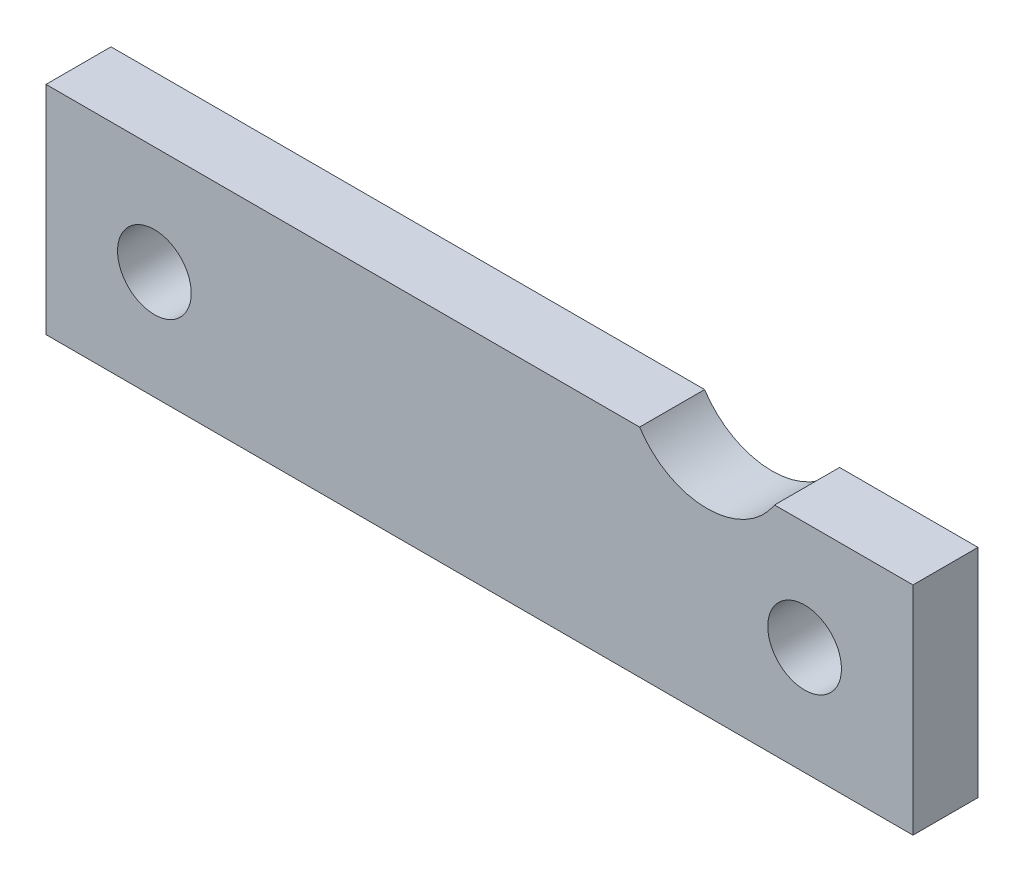
ISO-10303-21;
HEADER;
FILE_DESCRIPTION(('STEP AP214'),'2;1');
FILE_NAME('part.step','',(''),(''),'','','');
FILE_SCHEMA(('AUTOMOTIVE_DESIGN { 1 0 10303 214 1 1 1 1 }'));
ENDSEC;
DATA;
#1=APPLICATION_CONTEXT('core data for automotive mechanical design processes');
#2=APPLICATION_PROTOCOL_DEFINITION('international standard','automotive_design',2000,#1);
#3=PRODUCT_CONTEXT('',#1,'mechanical');
#4=PRODUCT('Part','Part','',(#3));
#5=PRODUCT_RELATED_PRODUCT_CATEGORY('part','',(#4));
#6=PRODUCT_DEFINITION_FORMATION('','',#4);
#7=PRODUCT_DEFINITION_CONTEXT('part definition',#1,'design');
#8=PRODUCT_DEFINITION('design','',#6,#7);
#9=PRODUCT_DEFINITION_SHAPE('','',#8);
#10=(LENGTH_UNIT() NAMED_UNIT(*) SI_UNIT(.MILLI.,.METRE.));
#11=(NAMED_UNIT(*) PLANE_ANGLE_UNIT() SI_UNIT($,.RADIAN.));
#12=(NAMED_UNIT(*) SI_UNIT($,.STERADIAN.) SOLID_ANGLE_UNIT());
#13=UNCERTAINTY_MEASURE_WITH_UNIT(LENGTH_MEASURE(1.E-05),#10,'distance_accuracy_value','');
#14=(GEOMETRIC_REPRESENTATION_CONTEXT(3) GLOBAL_UNCERTAINTY_ASSIGNED_CONTEXT((#13)) GLOBAL_UNIT_ASSIGNED_CONTEXT((#10,
#11,#12)) REPRESENTATION_CONTEXT('',''));
#15=CARTESIAN_POINT('',(0.,0.,0.));
#16=DIRECTION('',(0.,0.,1.));
#17=DIRECTION('',(1.,0.,0.));
#18=AXIS2_PLACEMENT_3D('',#15,#16,#17);
#19=CARTESIAN_POINT('',(35.,41.5,41.5));
#20=DIRECTION('',(-1.,0.,0.));
#21=DIRECTION('',(0.,0.,1.));
#22=AXIS2_PLACEMENT_3D('',#19,#20,#21);
#23=PLANE('',#22);
#24=DIRECTION('',(0.,-1.,0.));
#25=VECTOR('',#24,1.);
#26=CARTESIAN_POINT('',(35.,41.5,44.5));
#27=LINE('',#26,#25);
#28=CARTESIAN_POINT('',(35.,41.5,44.5));
#29=VERTEX_POINT('',#28);
#30=CARTESIAN_POINT('',(35.,31.5,44.5));
#31=VERTEX_POINT('',#30);
#32=EDGE_CURVE('E127',#29,#31,#27,.T.);
#33=ORIENTED_EDGE('',*,*,#32,.F.);
#34=DIRECTION('',(0.,0.,1.));
#35=VECTOR('',#34,1.);
#36=CARTESIAN_POINT('',(35.,41.5,41.5));
#37=LINE('',#36,#35);
#38=CARTESIAN_POINT('',(35.,41.5,41.5));
#39=VERTEX_POINT('',#38);
#40=EDGE_CURVE('E11',#39,#29,#37,.T.);
#41=ORIENTED_EDGE('',*,*,#40,.F.);
#42=DIRECTION('',(0.,-1.,0.));
#43=VECTOR('',#42,1.);
#44=CARTESIAN_POINT('',(35.,41.5,41.5));
#45=LINE('',#44,#43);
#46=CARTESIAN_POINT('',(35.,31.5,41.5));
#47=VERTEX_POINT('',#46);
#48=EDGE_CURVE('E143',#39,#47,#45,.T.);
#49=ORIENTED_EDGE('',*,*,#48,.T.);
#50=DIRECTION('',(0.,0.,1.));
#51=VECTOR('',#50,1.);
#52=CARTESIAN_POINT('',(35.,31.5,41.5));
#53=LINE('',#52,#51);
#54=EDGE_CURVE('E42',#47,#31,#53,.T.);
#55=ORIENTED_EDGE('',*,*,#54,.T.);
#56=EDGE_LOOP('',(#33,#41,#49,#55));
#57=FACE_BOUND('',#56,.T.);
#58=ADVANCED_FACE('F41',(#57),#23,.T.);
#59=CARTESIAN_POINT('',(35.,41.5,41.5));
#60=DIRECTION('',(0.,1.,0.));
#61=DIRECTION('',(0.,0.,1.));
#62=AXIS2_PLACEMENT_3D('',#59,#60,#61);
#63=PLANE('',#62);
#64=DIRECTION('',(-1.,0.,0.));
#65=VECTOR('',#64,1.);
#66=CARTESIAN_POINT('',(35.,41.5,44.5));
#67=LINE('',#66,#65);
#68=CARTESIAN_POINT('',(62.3871235167455,41.5,44.5));
#69=VERTEX_POINT('',#68);
#70=EDGE_CURVE('E136',#69,#29,#67,.T.);
#71=ORIENTED_EDGE('',*,*,#70,.F.);
#72=DIRECTION('',(0.,0.,1.));
#73=VECTOR('',#72,1.);
#74=CARTESIAN_POINT('',(62.3871235167455,41.5,41.5));
#75=LINE('',#74,#73);
#76=CARTESIAN_POINT('',(62.3871235167455,41.5,41.5));
#77=VERTEX_POINT('',#76);
#78=EDGE_CURVE('E49',#77,#69,#75,.T.);
#79=ORIENTED_EDGE('',*,*,#78,.F.);
#80=DIRECTION('',(-1.,0.,0.));
#81=VECTOR('',#80,1.);
#82=CARTESIAN_POINT('',(35.,41.5,41.5));
#83=LINE('',#82,#81);
#84=EDGE_CURVE('E117',#77,#39,#83,.T.);
#85=ORIENTED_EDGE('',*,*,#84,.T.);
#86=ORIENTED_EDGE('',*,*,#40,.T.);
#87=EDGE_LOOP('',(#71,#79,#85,#86));
#88=FACE_BOUND('',#87,.T.);
#89=ADVANCED_FACE('F149',(#88),#63,.T.);
#90=CARTESIAN_POINT('',(65.5,43.4999999999999,41.5));
#91=DIRECTION('',(0.,0.,1.));
#92=DIRECTION('',(1.,0.,0.));
#93=AXIS2_PLACEMENT_3D('',#90,#91,#92);
#94=CYLINDRICAL_SURFACE('',#93,3.69999999999988);
#95=CARTESIAN_POINT('',(65.5,43.4999999999999,44.5));
#96=DIRECTION('',(0.,0.,-1.));
#97=DIRECTION('',(1.,0.,0.));
#98=AXIS2_PLACEMENT_3D('',#95,#96,#97);
#99=CIRCLE('',#98,3.69999999999988);
#100=CARTESIAN_POINT('',(68.6128764832547,41.5000000000001,44.5));
#101=VERTEX_POINT('',#100);
#102=EDGE_CURVE('E103',#101,#69,#99,.T.);
#103=ORIENTED_EDGE('',*,*,#102,.F.);
#104=DIRECTION('',(0.,0.,1.));
#105=VECTOR('',#104,1.);
#106=CARTESIAN_POINT('',(68.6128764832547,41.5000000000001,41.5));
#107=LINE('',#106,#105);
#108=CARTESIAN_POINT('',(68.6128764832547,41.5000000000001,41.5));
#109=VERTEX_POINT('',#108);
#110=EDGE_CURVE('E98',#109,#101,#107,.T.);
#111=ORIENTED_EDGE('',*,*,#110,.F.);
#112=CARTESIAN_POINT('',(65.5,43.4999999999999,41.5));
#113=DIRECTION('',(0.,0.,-1.));
#114=DIRECTION('',(1.,0.,0.));
#115=AXIS2_PLACEMENT_3D('',#112,#113,#114);
#116=CIRCLE('',#115,3.69999999999988);
#117=EDGE_CURVE('E101',#109,#77,#116,.T.);
#118=ORIENTED_EDGE('',*,*,#117,.T.);
#119=ORIENTED_EDGE('',*,*,#78,.T.);
#120=EDGE_LOOP('',(#103,#111,#118,#119));
#121=FACE_BOUND('',#120,.T.);
#122=ADVANCED_FACE('F99',(#121),#94,.F.);
#123=CARTESIAN_POINT('',(68.6128764832548,41.5,41.5));
#124=DIRECTION('',(0.,1.,0.));
#125=DIRECTION('',(-1.,0.,0.));
#126=AXIS2_PLACEMENT_3D('',#123,#124,#125);
#127=PLANE('',#126);
#128=DIRECTION('',(-1.,0.,0.));
#129=VECTOR('',#128,1.);
#130=CARTESIAN_POINT('',(68.6128764832548,41.5,44.5));
#131=LINE('',#130,#129);
#132=CARTESIAN_POINT('',(75.,41.5,44.5));
#133=VERTEX_POINT('',#132);
#134=EDGE_CURVE('E137',#133,#101,#131,.T.);
#135=ORIENTED_EDGE('',*,*,#134,.F.);
#136=DIRECTION('',(0.,0.,1.));
#137=VECTOR('',#136,1.);
#138=CARTESIAN_POINT('',(75.,41.5,41.5));
#139=LINE('',#138,#137);
#140=CARTESIAN_POINT('',(75.,41.5,41.5));
#141=VERTEX_POINT('',#140);
#142=EDGE_CURVE('E107',#141,#133,#139,.T.);
#143=ORIENTED_EDGE('',*,*,#142,.F.);
#144=DIRECTION('',(-1.,0.,0.));
#145=VECTOR('',#144,1.);
#146=CARTESIAN_POINT('',(68.6128764832548,41.5,41.5));
#147=LINE('',#146,#145);
#148=EDGE_CURVE('E111',#141,#109,#147,.T.);
#149=ORIENTED_EDGE('',*,*,#148,.T.);
#150=ORIENTED_EDGE('',*,*,#110,.T.);
#151=EDGE_LOOP('',(#135,#143,#149,#150));
#152=FACE_BOUND('',#151,.T.);
#153=ADVANCED_FACE('F119',(#152),#127,.T.);
#154=CARTESIAN_POINT('',(75.,41.5,41.5));
#155=DIRECTION('',(1.,0.,0.));
#156=DIRECTION('',(0.,0.,-1.));
#157=AXIS2_PLACEMENT_3D('',#154,#155,#156);
#158=PLANE('',#157);
#159=DIRECTION('',(0.,1.,0.));
#160=VECTOR('',#159,1.);
#161=CARTESIAN_POINT('',(75.,41.5,44.5));
#162=LINE('',#161,#160);
#163=CARTESIAN_POINT('',(75.,31.5,44.5));
#164=VERTEX_POINT('',#163);
#165=EDGE_CURVE('E134',#164,#133,#162,.T.);
#166=ORIENTED_EDGE('',*,*,#165,.F.);
#167=DIRECTION('',(0.,0.,1.));
#168=VECTOR('',#167,1.);
#169=CARTESIAN_POINT('',(75.,31.5,41.5));
#170=LINE('',#169,#168);
#171=CARTESIAN_POINT('',(75.,31.5,41.5));
#172=VERTEX_POINT('',#171);
#173=EDGE_CURVE('E145',#172,#164,#170,.T.);
#174=ORIENTED_EDGE('',*,*,#173,.F.);
#175=DIRECTION('',(0.,1.,0.));
#176=VECTOR('',#175,1.);
#177=CARTESIAN_POINT('',(75.,41.5,41.5));
#178=LINE('',#177,#176);
#179=EDGE_CURVE('E116',#172,#141,#178,.T.);
#180=ORIENTED_EDGE('',*,*,#179,.T.);
#181=ORIENTED_EDGE('',*,*,#142,.T.);
#182=EDGE_LOOP('',(#166,#174,#180,#181));
#183=FACE_BOUND('',#182,.T.);
#184=ADVANCED_FACE('F165',(#183),#158,.T.);
#185=CARTESIAN_POINT('',(35.,31.5,41.5));
#186=DIRECTION('',(0.,-1.,0.));
#187=DIRECTION('',(0.,0.,-1.));
#188=AXIS2_PLACEMENT_3D('',#185,#186,#187);
#189=PLANE('',#188);
#190=DIRECTION('',(1.,0.,0.));
#191=VECTOR('',#190,1.);
#192=CARTESIAN_POINT('',(35.,31.5,44.5));
#193=LINE('',#192,#191);
#194=EDGE_CURVE('E129',#31,#164,#193,.T.);
#195=ORIENTED_EDGE('',*,*,#194,.F.);
#196=ORIENTED_EDGE('',*,*,#54,.F.);
#197=DIRECTION('',(1.,0.,0.));
#198=VECTOR('',#197,1.);
#199=CARTESIAN_POINT('',(35.,31.5,41.5));
#200=LINE('',#199,#198);
#201=EDGE_CURVE('E122',#47,#172,#200,.T.);
#202=ORIENTED_EDGE('',*,*,#201,.T.);
#203=ORIENTED_EDGE('',*,*,#173,.T.);
#204=EDGE_LOOP('',(#195,#196,#202,#203));
#205=FACE_BOUND('',#204,.T.);
#206=ADVANCED_FACE('F148',(#205),#189,.T.);
#207=CARTESIAN_POINT('',(65.5,43.4999999999999,41.5));
#208=DIRECTION('',(0.,0.,1.));
#209=DIRECTION('',(1.,0.,0.));
#210=AXIS2_PLACEMENT_3D('',#207,#208,#209);
#211=PLANE('',#210);
#212=CARTESIAN_POINT('',(70.,36.5,41.5));
#213=DIRECTION('',(0.,0.,1.));
#214=DIRECTION('',(1.,0.,0.));
#215=AXIS2_PLACEMENT_3D('',#212,#213,#214);
#216=CIRCLE('',#215,1.69999999999999);
#217=CARTESIAN_POINT('',(71.7,36.5,41.5));
#218=VERTEX_POINT('',#217);
#219=EDGE_CURVE('E189',#218,#218,#216,.T.);
#220=ORIENTED_EDGE('',*,*,#219,.T.);
#221=EDGE_LOOP('',(#220));
#222=FACE_BOUND('',#221,.T.);
#223=CARTESIAN_POINT('',(40.,36.5,41.5));
#224=DIRECTION('',(0.,0.,1.));
#225=DIRECTION('',(1.,0.,0.));
#226=AXIS2_PLACEMENT_3D('',#223,#224,#225);
#227=CIRCLE('',#226,1.7);
#228=CARTESIAN_POINT('',(41.7,36.5,41.5));
#229=VERTEX_POINT('',#228);
#230=EDGE_CURVE('E128',#229,#229,#227,.T.);
#231=ORIENTED_EDGE('',*,*,#230,.T.);
#232=EDGE_LOOP('',(#231));
#233=FACE_BOUND('',#232,.T.);
#234=ORIENTED_EDGE('',*,*,#48,.F.);
#235=ORIENTED_EDGE('',*,*,#84,.F.);
#236=ORIENTED_EDGE('',*,*,#117,.F.);
#237=ORIENTED_EDGE('',*,*,#148,.F.);
#238=ORIENTED_EDGE('',*,*,#179,.F.);
#239=ORIENTED_EDGE('',*,*,#201,.F.);
#240=EDGE_LOOP('',(#234,#235,#236,#237,#238,#239));
#241=FACE_BOUND('',#240,.T.);
#242=ADVANCED_FACE('F115',(#222,#233,#241),#211,.F.);
#243=CARTESIAN_POINT('',(65.5,43.4999999999999,44.5));
#244=DIRECTION('',(0.,0.,1.));
#245=DIRECTION('',(1.,0.,0.));
#246=AXIS2_PLACEMENT_3D('',#243,#244,#245);
#247=PLANE('',#246);
#248=CARTESIAN_POINT('',(70.,36.5,44.5));
#249=DIRECTION('',(0.,0.,1.));
#250=DIRECTION('',(1.,0.,0.));
#251=AXIS2_PLACEMENT_3D('',#248,#249,#250);
#252=CIRCLE('',#251,1.69999999999999);
#253=CARTESIAN_POINT('',(71.7,36.5,44.5));
#254=VERTEX_POINT('',#253);
#255=EDGE_CURVE('E192',#254,#254,#252,.T.);
#256=ORIENTED_EDGE('',*,*,#255,.F.);
#257=EDGE_LOOP('',(#256));
#258=FACE_BOUND('',#257,.T.);
#259=CARTESIAN_POINT('',(40.,36.5,44.5));
#260=DIRECTION('',(0.,0.,1.));
#261=DIRECTION('',(1.,0.,0.));
#262=AXIS2_PLACEMENT_3D('',#259,#260,#261);
#263=CIRCLE('',#262,1.7);
#264=CARTESIAN_POINT('',(41.7,36.5,44.5));
#265=VERTEX_POINT('',#264);
#266=EDGE_CURVE('E194',#265,#265,#263,.T.);
#267=ORIENTED_EDGE('',*,*,#266,.F.);
#268=EDGE_LOOP('',(#267));
#269=FACE_BOUND('',#268,.T.);
#270=ORIENTED_EDGE('',*,*,#32,.T.);
#271=ORIENTED_EDGE('',*,*,#194,.T.);
#272=ORIENTED_EDGE('',*,*,#165,.T.);
#273=ORIENTED_EDGE('',*,*,#134,.T.);
#274=ORIENTED_EDGE('',*,*,#102,.T.);
#275=ORIENTED_EDGE('',*,*,#70,.T.);
#276=EDGE_LOOP('',(#270,#271,#272,#273,#274,#275));
#277=FACE_BOUND('',#276,.T.);
#278=ADVANCED_FACE('F146',(#258,#269,#277),#247,.T.);
#279=CARTESIAN_POINT('',(40.,36.5,41.5));
#280=DIRECTION('',(0.,0.,1.));
#281=DIRECTION('',(1.,0.,0.));
#282=AXIS2_PLACEMENT_3D('',#279,#280,#281);
#283=CYLINDRICAL_SURFACE('',#282,1.7);
#284=ORIENTED_EDGE('',*,*,#230,.F.);
#285=EDGE_LOOP('',(#284));
#286=FACE_BOUND('',#285,.T.);
#287=ORIENTED_EDGE('',*,*,#266,.T.);
#288=EDGE_LOOP('',(#287));
#289=FACE_BOUND('',#288,.T.);
#290=ADVANCED_FACE('F174',(#286,#289),#283,.F.);
#291=CARTESIAN_POINT('',(70.,36.5,41.5));
#292=DIRECTION('',(0.,0.,1.));
#293=DIRECTION('',(1.,0.,0.));
#294=AXIS2_PLACEMENT_3D('',#291,#292,#293);
#295=CYLINDRICAL_SURFACE('',#294,1.69999999999999);
#296=ORIENTED_EDGE('',*,*,#219,.F.);
#297=EDGE_LOOP('',(#296));
#298=FACE_BOUND('',#297,.T.);
#299=ORIENTED_EDGE('',*,*,#255,.T.);
#300=EDGE_LOOP('',(#299));
#301=FACE_BOUND('',#300,.T.);
#302=ADVANCED_FACE('F178',(#298,#301),#295,.F.);
#303=CLOSED_SHELL('',(#58,#89,#122,#153,#184,#206,#242,#278,#290,#302));
#304=MANIFOLD_SOLID_BREP('B2',#303);
#305=ADVANCED_BREP_SHAPE_REPRESENTATION('',(#18,#304),#14);
#306=SHAPE_DEFINITION_REPRESENTATION(#9,#305);
ENDSEC;
END-ISO-10303-21;
